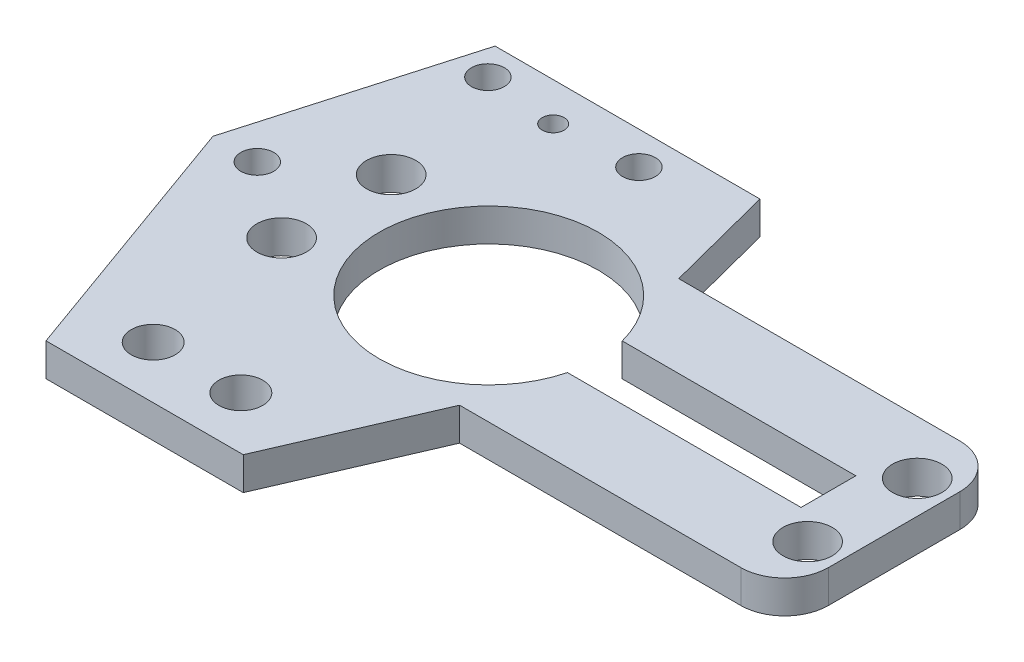
ISO-10303-21;
HEADER;
FILE_DESCRIPTION(('STEP AP214'),'2;1');
FILE_NAME('part.step','',(''),(''),'','','');
FILE_SCHEMA(('AUTOMOTIVE_DESIGN { 1 0 10303 214 1 1 1 1 }'));
ENDSEC;
DATA;
#1=APPLICATION_CONTEXT('core data for automotive mechanical design processes');
#2=APPLICATION_PROTOCOL_DEFINITION('international standard','automotive_design',2000,#1);
#3=PRODUCT_CONTEXT('',#1,'mechanical');
#4=PRODUCT('Part','Part','',(#3));
#5=PRODUCT_RELATED_PRODUCT_CATEGORY('part','',(#4));
#6=PRODUCT_DEFINITION_FORMATION('','',#4);
#7=PRODUCT_DEFINITION_CONTEXT('part definition',#1,'design');
#8=PRODUCT_DEFINITION('design','',#6,#7);
#9=PRODUCT_DEFINITION_SHAPE('','',#8);
#10=(LENGTH_UNIT() NAMED_UNIT(*) SI_UNIT(.MILLI.,.METRE.));
#11=(NAMED_UNIT(*) PLANE_ANGLE_UNIT() SI_UNIT($,.RADIAN.));
#12=(NAMED_UNIT(*) SI_UNIT($,.STERADIAN.) SOLID_ANGLE_UNIT());
#13=UNCERTAINTY_MEASURE_WITH_UNIT(LENGTH_MEASURE(1.E-05),#10,'distance_accuracy_value','');
#14=(GEOMETRIC_REPRESENTATION_CONTEXT(3) GLOBAL_UNCERTAINTY_ASSIGNED_CONTEXT((#13)) GLOBAL_UNIT_ASSIGNED_CONTEXT((#10,
#11,#12)) REPRESENTATION_CONTEXT('',''));
#15=CARTESIAN_POINT('',(0.,0.,0.));
#16=DIRECTION('',(0.,0.,1.));
#17=DIRECTION('',(1.,0.,0.));
#18=AXIS2_PLACEMENT_3D('',#15,#16,#17);
#19=CARTESIAN_POINT('',(0.,3.,0.));
#20=DIRECTION('',(0.,-1.,0.));
#21=DIRECTION('',(0.,0.,-1.));
#22=AXIS2_PLACEMENT_3D('',#19,#20,#21);
#23=PLANE('',#22);
#24=CARTESIAN_POINT('',(-4.,3.,19.));
#25=DIRECTION('',(0.,1.,0.));
#26=DIRECTION('',(0.,0.,1.));
#27=AXIS2_PLACEMENT_3D('',#24,#25,#26);
#28=CIRCLE('',#27,2.);
#29=CARTESIAN_POINT('',(-4.,3.,21.));
#30=VERTEX_POINT('',#29);
#31=EDGE_CURVE('E190',#30,#30,#28,.T.);
#32=ORIENTED_EDGE('',*,*,#31,.F.);
#33=EDGE_LOOP('',(#32));
#34=FACE_BOUND('',#33,.T.);
#35=CARTESIAN_POINT('',(4.32492884768633,3.,-17.));
#36=DIRECTION('',(0.,1.,0.));
#37=DIRECTION('',(0.,0.,1.));
#38=AXIS2_PLACEMENT_3D('',#35,#36,#37);
#39=CIRCLE('',#38,1.5);
#40=CARTESIAN_POINT('',(4.32492884768633,3.,-15.5));
#41=VERTEX_POINT('',#40);
#42=EDGE_CURVE('E196',#41,#41,#39,.T.);
#43=ORIENTED_EDGE('',*,*,#42,.F.);
#44=EDGE_LOOP('',(#43));
#45=FACE_BOUND('',#44,.T.);
#46=DIRECTION('',(1.,0.,0.));
#47=VECTOR('',#46,1.);
#48=CARTESIAN_POINT('',(44.6176903848182,3.,10.));
#49=LINE('',#48,#47);
#50=CARTESIAN_POINT('',(14.9564404640531,3.,10.));
#51=VERTEX_POINT('',#50);
#52=CARTESIAN_POINT('',(40.6176903848182,3.,10.));
#53=VERTEX_POINT('',#52);
#54=EDGE_CURVE('E208',#51,#53,#49,.T.);
#55=ORIENTED_EDGE('',*,*,#54,.T.);
#56=CARTESIAN_POINT('',(40.6176903848182,3.,6.));
#57=DIRECTION('',(0.,-1.,0.));
#58=DIRECTION('',(0.,0.,-1.));
#59=AXIS2_PLACEMENT_3D('',#56,#57,#58);
#60=CIRCLE('',#59,4.);
#61=CARTESIAN_POINT('',(44.6176903848182,3.,6.));
#62=VERTEX_POINT('',#61);
#63=EDGE_CURVE('E43',#53,#62,#60,.F.);
#64=ORIENTED_EDGE('',*,*,#63,.T.);
#65=DIRECTION('',(0.,0.,-1.));
#66=VECTOR('',#65,1.);
#67=CARTESIAN_POINT('',(44.6176903848182,3.,-10.));
#68=LINE('',#67,#66);
#69=CARTESIAN_POINT('',(44.6176903848182,3.,-6.));
#70=VERTEX_POINT('',#69);
#71=EDGE_CURVE('E210',#62,#70,#68,.T.);
#72=ORIENTED_EDGE('',*,*,#71,.T.);
#73=CARTESIAN_POINT('',(40.6176903848182,3.,-6.));
#74=DIRECTION('',(0.,-1.,0.));
#75=DIRECTION('',(0.,0.,-1.));
#76=AXIS2_PLACEMENT_3D('',#73,#74,#75);
#77=CIRCLE('',#76,4.);
#78=CARTESIAN_POINT('',(40.6176903848182,3.,-10.));
#79=VERTEX_POINT('',#78);
#80=EDGE_CURVE('E50',#70,#79,#77,.F.);
#81=ORIENTED_EDGE('',*,*,#80,.T.);
#82=DIRECTION('',(-1.,0.,0.));
#83=VECTOR('',#82,1.);
#84=CARTESIAN_POINT('',(14.9564404640531,3.,-10.));
#85=LINE('',#84,#83);
#86=CARTESIAN_POINT('',(14.9564404640531,3.,-10.));
#87=VERTEX_POINT('',#86);
#88=EDGE_CURVE('E212',#79,#87,#85,.T.);
#89=ORIENTED_EDGE('',*,*,#88,.T.);
#90=DIRECTION('',(-0.250640756696312,0.,-0.968080167694133));
#91=VECTOR('',#90,1.);
#92=CARTESIAN_POINT('',(12.3673908681574,3.,-20.));
#93=LINE('',#92,#91);
#94=CARTESIAN_POINT('',(12.3673908681574,3.,-20.));
#95=VERTEX_POINT('',#94);
#96=EDGE_CURVE('E214',#87,#95,#93,.T.);
#97=ORIENTED_EDGE('',*,*,#96,.T.);
#98=DIRECTION('',(-1.,0.,0.));
#99=VECTOR('',#98,1.);
#100=CARTESIAN_POINT('',(-11.8001879667638,3.,-20.));
#101=LINE('',#100,#99);
#102=CARTESIAN_POINT('',(-11.8001879667638,3.,-20.));
#103=VERTEX_POINT('',#102);
#104=EDGE_CURVE('E216',#95,#103,#101,.T.);
#105=ORIENTED_EDGE('',*,*,#104,.T.);
#106=DIRECTION('',(-0.276187977770996,0.,0.961103636937645));
#107=VECTOR('',#106,1.);
#108=CARTESIAN_POINT('',(-17.5474969385831,3.,0.));
#109=LINE('',#108,#107);
#110=CARTESIAN_POINT('',(-17.5474969385831,3.,0.));
#111=VERTEX_POINT('',#110);
#112=EDGE_CURVE('E218',#103,#111,#109,.T.);
#113=ORIENTED_EDGE('',*,*,#112,.T.);
#114=DIRECTION('',(0.33824944508403,0.,0.941056487624598));
#115=VECTOR('',#114,1.);
#116=CARTESIAN_POINT('',(-9.,3.,23.7803123224836));
#117=LINE('',#116,#115);
#118=CARTESIAN_POINT('',(-9.,3.,23.7803123224836));
#119=VERTEX_POINT('',#118);
#120=EDGE_CURVE('E220',#111,#119,#117,.T.);
#121=ORIENTED_EDGE('',*,*,#120,.T.);
#122=DIRECTION('',(1.,0.,0.));
#123=VECTOR('',#122,1.);
#124=CARTESIAN_POINT('',(-9.,3.,23.7803123224836));
#125=LINE('',#124,#123);
#126=CARTESIAN_POINT('',(9.,3.,23.7803123224836));
#127=VERTEX_POINT('',#126);
#128=EDGE_CURVE('E202',#119,#127,#125,.T.);
#129=ORIENTED_EDGE('',*,*,#128,.T.);
#130=DIRECTION('',(0.39676448254901,0.,-0.917920446110455));
#131=VECTOR('',#130,1.);
#132=CARTESIAN_POINT('',(14.9564404640531,3.,10.));
#133=LINE('',#132,#131);
#134=EDGE_CURVE('E205',#127,#51,#133,.T.);
#135=ORIENTED_EDGE('',*,*,#134,.T.);
#136=EDGE_LOOP('',(#55,#64,#72,#81,#89,#97,#105,#113,#121,#129,#135));
#137=FACE_BOUND('',#136,.T.);
#138=DIRECTION('',(0.,0.,-1.));
#139=VECTOR('',#138,1.);
#140=CARTESIAN_POINT('',(38.6176903848183,3.,2.5));
#141=LINE('',#140,#139);
#142=CARTESIAN_POINT('',(38.6176903848183,3.,2.5));
#143=VERTEX_POINT('',#142);
#144=CARTESIAN_POINT('',(38.6176903848183,3.,-2.5));
#145=VERTEX_POINT('',#144);
#146=EDGE_CURVE('E146',#143,#145,#141,.T.);
#147=ORIENTED_EDGE('',*,*,#146,.F.);
#148=DIRECTION('',(1.,0.,0.));
#149=VECTOR('',#148,1.);
#150=CARTESIAN_POINT('',(17.3001487503368,3.,2.5));
#151=LINE('',#150,#149);
#152=CARTESIAN_POINT('',(17.3001487503368,3.,2.5));
#153=VERTEX_POINT('',#152);
#154=EDGE_CURVE('E172',#153,#143,#151,.T.);
#155=ORIENTED_EDGE('',*,*,#154,.F.);
#156=CARTESIAN_POINT('',(7.61769038481825,3.,0.));
#157=DIRECTION('',(0.,1.,0.));
#158=DIRECTION('',(0.,0.,1.));
#159=AXIS2_PLACEMENT_3D('',#156,#157,#158);
#160=CIRCLE('',#159,9.99999999999999);
#161=CARTESIAN_POINT('',(17.3001487503368,3.,-2.5));
#162=VERTEX_POINT('',#161);
#163=EDGE_CURVE('E170',#162,#153,#160,.T.);
#164=ORIENTED_EDGE('',*,*,#163,.F.);
#165=DIRECTION('',(-1.,0.,0.));
#166=VECTOR('',#165,1.);
#167=CARTESIAN_POINT('',(38.6176903848183,3.,-2.5));
#168=LINE('',#167,#166);
#169=EDGE_CURVE('E156',#145,#162,#168,.T.);
#170=ORIENTED_EDGE('',*,*,#169,.F.);
#171=EDGE_LOOP('',(#147,#155,#164,#170));
#172=FACE_BOUND('',#171,.T.);
#173=CARTESIAN_POINT('',(4.,3.,19.));
#174=DIRECTION('',(0.,1.,0.));
#175=DIRECTION('',(0.,0.,1.));
#176=AXIS2_PLACEMENT_3D('',#173,#174,#175);
#177=CIRCLE('',#176,2.);
#178=CARTESIAN_POINT('',(4.,3.,21.));
#179=VERTEX_POINT('',#178);
#180=EDGE_CURVE('E179',#179,#179,#177,.T.);
#181=ORIENTED_EDGE('',*,*,#180,.F.);
#182=EDGE_LOOP('',(#181));
#183=FACE_BOUND('',#182,.T.);
#184=CARTESIAN_POINT('',(-3.,3.,-16.5));
#185=DIRECTION('',(0.,1.,0.));
#186=DIRECTION('',(0.,0.,1.));
#187=AXIS2_PLACEMENT_3D('',#184,#185,#186);
#188=CIRCLE('',#187,1.);
#189=CARTESIAN_POINT('',(-3.,3.,-15.5));
#190=VERTEX_POINT('',#189);
#191=EDGE_CURVE('E603',#190,#190,#188,.T.);
#192=ORIENTED_EDGE('',*,*,#191,.F.);
#193=EDGE_LOOP('',(#192));
#194=FACE_BOUND('',#193,.T.);
#195=CARTESIAN_POINT('',(-13.5,3.,0.));
#196=DIRECTION('',(0.,1.,0.));
#197=DIRECTION('',(0.,0.,1.));
#198=AXIS2_PLACEMENT_3D('',#195,#196,#197);
#199=CIRCLE('',#198,1.5);
#200=CARTESIAN_POINT('',(-13.5,3.,1.5));
#201=VERTEX_POINT('',#200);
#202=EDGE_CURVE('E597',#201,#201,#199,.T.);
#203=ORIENTED_EDGE('',*,*,#202,.F.);
#204=EDGE_LOOP('',(#203));
#205=FACE_BOUND('',#204,.T.);
#206=CARTESIAN_POINT('',(-9.67339824004157,3.,-17.2164226073759));
#207=DIRECTION('',(0.,1.,0.));
#208=DIRECTION('',(0.,0.,1.));
#209=AXIS2_PLACEMENT_3D('',#206,#207,#208);
#210=CIRCLE('',#209,1.5);
#211=CARTESIAN_POINT('',(-9.67339824004157,3.,-15.7164226073759));
#212=VERTEX_POINT('',#211);
#213=EDGE_CURVE('E591',#212,#212,#210,.T.);
#214=ORIENTED_EDGE('',*,*,#213,.F.);
#215=EDGE_LOOP('',(#214));
#216=FACE_BOUND('',#215,.T.);
#217=CARTESIAN_POINT('',(41.6176903848183,3.,-5.09999999999996));
#218=DIRECTION('',(0.,1.,0.));
#219=DIRECTION('',(0.,0.,1.));
#220=AXIS2_PLACEMENT_3D('',#217,#218,#219);
#221=CIRCLE('',#220,2.25);
#222=CARTESIAN_POINT('',(41.6176903848183,3.,-2.84999999999995));
#223=VERTEX_POINT('',#222);
#224=EDGE_CURVE('E585',#223,#223,#221,.T.);
#225=ORIENTED_EDGE('',*,*,#224,.F.);
#226=EDGE_LOOP('',(#225));
#227=FACE_BOUND('',#226,.T.);
#228=CARTESIAN_POINT('',(41.6176903848183,3.,4.90000000000005));
#229=DIRECTION('',(0.,1.,0.));
#230=DIRECTION('',(0.,0.,1.));
#231=AXIS2_PLACEMENT_3D('',#228,#229,#230);
#232=CIRCLE('',#231,2.25);
#233=CARTESIAN_POINT('',(41.6176903848183,3.,7.15000000000005));
#234=VERTEX_POINT('',#233);
#235=EDGE_CURVE('E579',#234,#234,#232,.T.);
#236=ORIENTED_EDGE('',*,*,#235,.F.);
#237=EDGE_LOOP('',(#236));
#238=FACE_BOUND('',#237,.T.);
#239=CARTESIAN_POINT('',(-6.38230961518174,3.,4.90000000000005));
#240=DIRECTION('',(0.,1.,0.));
#241=DIRECTION('',(0.,0.,1.));
#242=AXIS2_PLACEMENT_3D('',#239,#240,#241);
#243=CIRCLE('',#242,2.25);
#244=CARTESIAN_POINT('',(-6.38230961518174,3.,7.15000000000005));
#245=VERTEX_POINT('',#244);
#246=EDGE_CURVE('E573',#245,#245,#243,.T.);
#247=ORIENTED_EDGE('',*,*,#246,.F.);
#248=EDGE_LOOP('',(#247));
#249=FACE_BOUND('',#248,.T.);
#250=CARTESIAN_POINT('',(-6.38230961518174,3.,-5.09999999999996));
#251=DIRECTION('',(0.,1.,0.));
#252=DIRECTION('',(0.,0.,1.));
#253=AXIS2_PLACEMENT_3D('',#250,#251,#252);
#254=CIRCLE('',#253,2.25);
#255=CARTESIAN_POINT('',(-6.38230961518174,3.,-2.84999999999995));
#256=VERTEX_POINT('',#255);
#257=EDGE_CURVE('E564',#256,#256,#254,.T.);
#258=ORIENTED_EDGE('',*,*,#257,.F.);
#259=EDGE_LOOP('',(#258));
#260=FACE_BOUND('',#259,.T.);
#261=ADVANCED_FACE('F35',(#34,#45,#137,#172,#183,#194,#205,#216,#227,#238,#249,#260),#23,.F.);
#262=CARTESIAN_POINT('',(0.,0.,0.));
#263=DIRECTION('',(0.,-1.,0.));
#264=DIRECTION('',(0.,0.,-1.));
#265=AXIS2_PLACEMENT_3D('',#262,#263,#264);
#266=PLANE('',#265);
#267=CARTESIAN_POINT('',(-6.38230961518174,0.,4.90000000000005));
#268=DIRECTION('',(0.,1.,0.));
#269=DIRECTION('',(0.,0.,1.));
#270=AXIS2_PLACEMENT_3D('',#267,#268,#269);
#271=CIRCLE('',#270,2.25);
#272=CARTESIAN_POINT('',(-6.38230961518174,0.,7.15000000000005));
#273=VERTEX_POINT('',#272);
#274=EDGE_CURVE('E570',#273,#273,#271,.T.);
#275=ORIENTED_EDGE('',*,*,#274,.T.);
#276=EDGE_LOOP('',(#275));
#277=FACE_BOUND('',#276,.T.);
#278=CARTESIAN_POINT('',(41.6176903848183,0.,-5.09999999999996));
#279=DIRECTION('',(0.,1.,0.));
#280=DIRECTION('',(0.,0.,1.));
#281=AXIS2_PLACEMENT_3D('',#278,#279,#280);
#282=CIRCLE('',#281,2.25);
#283=CARTESIAN_POINT('',(41.6176903848183,0.,-2.84999999999995));
#284=VERTEX_POINT('',#283);
#285=EDGE_CURVE('E582',#284,#284,#282,.T.);
#286=ORIENTED_EDGE('',*,*,#285,.T.);
#287=EDGE_LOOP('',(#286));
#288=FACE_BOUND('',#287,.T.);
#289=CARTESIAN_POINT('',(-13.5,0.,0.));
#290=DIRECTION('',(0.,1.,0.));
#291=DIRECTION('',(0.,0.,1.));
#292=AXIS2_PLACEMENT_3D('',#289,#290,#291);
#293=CIRCLE('',#292,1.5);
#294=CARTESIAN_POINT('',(-13.5,0.,1.5));
#295=VERTEX_POINT('',#294);
#296=EDGE_CURVE('E594',#295,#295,#293,.T.);
#297=ORIENTED_EDGE('',*,*,#296,.T.);
#298=EDGE_LOOP('',(#297));
#299=FACE_BOUND('',#298,.T.);
#300=CARTESIAN_POINT('',(4.,0.,19.));
#301=DIRECTION('',(0.,1.,0.));
#302=DIRECTION('',(0.,0.,1.));
#303=AXIS2_PLACEMENT_3D('',#300,#301,#302);
#304=CIRCLE('',#303,2.);
#305=CARTESIAN_POINT('',(4.,0.,21.));
#306=VERTEX_POINT('',#305);
#307=EDGE_CURVE('E606',#306,#306,#304,.T.);
#308=ORIENTED_EDGE('',*,*,#307,.T.);
#309=EDGE_LOOP('',(#308));
#310=FACE_BOUND('',#309,.T.);
#311=CARTESIAN_POINT('',(4.32492884768633,0.,-17.));
#312=DIRECTION('',(0.,1.,0.));
#313=DIRECTION('',(0.,0.,1.));
#314=AXIS2_PLACEMENT_3D('',#311,#312,#313);
#315=CIRCLE('',#314,1.5);
#316=CARTESIAN_POINT('',(4.32492884768633,0.,-15.5));
#317=VERTEX_POINT('',#316);
#318=EDGE_CURVE('E193',#317,#317,#315,.T.);
#319=ORIENTED_EDGE('',*,*,#318,.T.);
#320=EDGE_LOOP('',(#319));
#321=FACE_BOUND('',#320,.T.);
#322=DIRECTION('',(0.,0.,-1.));
#323=VECTOR('',#322,1.);
#324=CARTESIAN_POINT('',(44.6176903848182,0.,-10.));
#325=LINE('',#324,#323);
#326=CARTESIAN_POINT('',(44.6176903848182,0.,6.));
#327=VERTEX_POINT('',#326);
#328=CARTESIAN_POINT('',(44.6176903848182,0.,-6.));
#329=VERTEX_POINT('',#328);
#330=EDGE_CURVE('E229',#327,#329,#325,.T.);
#331=ORIENTED_EDGE('',*,*,#330,.F.);
#332=CARTESIAN_POINT('',(40.6176903848182,0.,6.));
#333=DIRECTION('',(0.,-1.,0.));
#334=DIRECTION('',(0.,0.,-1.));
#335=AXIS2_PLACEMENT_3D('',#332,#333,#334);
#336=CIRCLE('',#335,4.);
#337=CARTESIAN_POINT('',(40.6176903848182,0.,10.));
#338=VERTEX_POINT('',#337);
#339=EDGE_CURVE('E268',#327,#338,#336,.T.);
#340=ORIENTED_EDGE('',*,*,#339,.T.);
#341=DIRECTION('',(1.,0.,0.));
#342=VECTOR('',#341,1.);
#343=CARTESIAN_POINT('',(44.6176903848182,0.,10.));
#344=LINE('',#343,#342);
#345=CARTESIAN_POINT('',(14.9564404640531,0.,10.));
#346=VERTEX_POINT('',#345);
#347=EDGE_CURVE('E227',#346,#338,#344,.T.);
#348=ORIENTED_EDGE('',*,*,#347,.F.);
#349=DIRECTION('',(0.39676448254901,0.,-0.917920446110455));
#350=VECTOR('',#349,1.);
#351=CARTESIAN_POINT('',(14.9564404640531,0.,10.));
#352=LINE('',#351,#350);
#353=CARTESIAN_POINT('',(9.,0.,23.7803123224836));
#354=VERTEX_POINT('',#353);
#355=EDGE_CURVE('E225',#354,#346,#352,.T.);
#356=ORIENTED_EDGE('',*,*,#355,.F.);
#357=DIRECTION('',(1.,0.,0.));
#358=VECTOR('',#357,1.);
#359=CARTESIAN_POINT('',(-9.,0.,23.7803123224836));
#360=LINE('',#359,#358);
#361=CARTESIAN_POINT('',(-9.,0.,23.7803123224836));
#362=VERTEX_POINT('',#361);
#363=EDGE_CURVE('E199',#362,#354,#360,.T.);
#364=ORIENTED_EDGE('',*,*,#363,.F.);
#365=DIRECTION('',(0.33824944508403,0.,0.941056487624598));
#366=VECTOR('',#365,1.);
#367=CARTESIAN_POINT('',(-9.,0.,23.7803123224836));
#368=LINE('',#367,#366);
#369=CARTESIAN_POINT('',(-17.5474969385831,0.,0.));
#370=VERTEX_POINT('',#369);
#371=EDGE_CURVE('E206',#370,#362,#368,.T.);
#372=ORIENTED_EDGE('',*,*,#371,.F.);
#373=DIRECTION('',(-0.276187977770996,0.,0.961103636937645));
#374=VECTOR('',#373,1.);
#375=CARTESIAN_POINT('',(-17.5474969385831,0.,0.));
#376=LINE('',#375,#374);
#377=CARTESIAN_POINT('',(-11.8001879667638,0.,-20.));
#378=VERTEX_POINT('',#377);
#379=EDGE_CURVE('E238',#378,#370,#376,.T.);
#380=ORIENTED_EDGE('',*,*,#379,.F.);
#381=DIRECTION('',(-1.,0.,0.));
#382=VECTOR('',#381,1.);
#383=CARTESIAN_POINT('',(-11.8001879667638,0.,-20.));
#384=LINE('',#383,#382);
#385=CARTESIAN_POINT('',(12.3673908681574,0.,-20.));
#386=VERTEX_POINT('',#385);
#387=EDGE_CURVE('E236',#386,#378,#384,.T.);
#388=ORIENTED_EDGE('',*,*,#387,.F.);
#389=DIRECTION('',(-0.250640756696312,0.,-0.968080167694133));
#390=VECTOR('',#389,1.);
#391=CARTESIAN_POINT('',(12.3673908681574,0.,-20.));
#392=LINE('',#391,#390);
#393=CARTESIAN_POINT('',(14.9564404640531,0.,-10.));
#394=VERTEX_POINT('',#393);
#395=EDGE_CURVE('E234',#394,#386,#392,.T.);
#396=ORIENTED_EDGE('',*,*,#395,.F.);
#397=DIRECTION('',(-1.,0.,0.));
#398=VECTOR('',#397,1.);
#399=CARTESIAN_POINT('',(14.9564404640531,0.,-10.));
#400=LINE('',#399,#398);
#401=CARTESIAN_POINT('',(40.6176903848182,0.,-10.));
#402=VERTEX_POINT('',#401);
#403=EDGE_CURVE('E232',#402,#394,#400,.T.);
#404=ORIENTED_EDGE('',*,*,#403,.F.);
#405=CARTESIAN_POINT('',(40.6176903848182,0.,-6.));
#406=DIRECTION('',(0.,-1.,0.));
#407=DIRECTION('',(0.,0.,-1.));
#408=AXIS2_PLACEMENT_3D('',#405,#406,#407);
#409=CIRCLE('',#408,4.);
#410=EDGE_CURVE('E266',#402,#329,#409,.T.);
#411=ORIENTED_EDGE('',*,*,#410,.T.);
#412=EDGE_LOOP('',(#331,#340,#348,#356,#364,#372,#380,#388,#396,#404,#411));
#413=FACE_BOUND('',#412,.T.);
#414=CARTESIAN_POINT('',(-4.,0.,19.));
#415=DIRECTION('',(0.,1.,0.));
#416=DIRECTION('',(0.,0.,1.));
#417=AXIS2_PLACEMENT_3D('',#414,#415,#416);
#418=CIRCLE('',#417,2.);
#419=CARTESIAN_POINT('',(-4.,0.,21.));
#420=VERTEX_POINT('',#419);
#421=EDGE_CURVE('E164',#420,#420,#418,.T.);
#422=ORIENTED_EDGE('',*,*,#421,.T.);
#423=EDGE_LOOP('',(#422));
#424=FACE_BOUND('',#423,.T.);
#425=DIRECTION('',(1.,0.,0.));
#426=VECTOR('',#425,1.);
#427=CARTESIAN_POINT('',(17.3001487503368,0.,2.5));
#428=LINE('',#427,#426);
#429=CARTESIAN_POINT('',(17.3001487503368,0.,2.5));
#430=VERTEX_POINT('',#429);
#431=CARTESIAN_POINT('',(38.6176903848183,0.,2.5));
#432=VERTEX_POINT('',#431);
#433=EDGE_CURVE('E157',#430,#432,#428,.T.);
#434=ORIENTED_EDGE('',*,*,#433,.T.);
#435=DIRECTION('',(0.,0.,-1.));
#436=VECTOR('',#435,1.);
#437=CARTESIAN_POINT('',(38.6176903848183,0.,2.5));
#438=LINE('',#437,#436);
#439=CARTESIAN_POINT('',(38.6176903848183,0.,-2.5));
#440=VERTEX_POINT('',#439);
#441=EDGE_CURVE('E177',#432,#440,#438,.T.);
#442=ORIENTED_EDGE('',*,*,#441,.T.);
#443=DIRECTION('',(-1.,0.,0.));
#444=VECTOR('',#443,1.);
#445=CARTESIAN_POINT('',(38.6176903848183,0.,-2.5));
#446=LINE('',#445,#444);
#447=CARTESIAN_POINT('',(17.3001487503368,0.,-2.5));
#448=VERTEX_POINT('',#447);
#449=EDGE_CURVE('E163',#440,#448,#446,.T.);
#450=ORIENTED_EDGE('',*,*,#449,.T.);
#451=CARTESIAN_POINT('',(7.61769038481825,0.,0.));
#452=DIRECTION('',(0.,1.,0.));
#453=DIRECTION('',(0.,0.,1.));
#454=AXIS2_PLACEMENT_3D('',#451,#452,#453);
#455=CIRCLE('',#454,9.99999999999999);
#456=EDGE_CURVE('E181',#448,#430,#455,.T.);
#457=ORIENTED_EDGE('',*,*,#456,.T.);
#458=EDGE_LOOP('',(#434,#442,#450,#457));
#459=FACE_BOUND('',#458,.T.);
#460=CARTESIAN_POINT('',(-3.,0.,-16.5));
#461=DIRECTION('',(0.,1.,0.));
#462=DIRECTION('',(0.,0.,1.));
#463=AXIS2_PLACEMENT_3D('',#460,#461,#462);
#464=CIRCLE('',#463,1.);
#465=CARTESIAN_POINT('',(-3.,0.,-15.5));
#466=VERTEX_POINT('',#465);
#467=EDGE_CURVE('E600',#466,#466,#464,.T.);
#468=ORIENTED_EDGE('',*,*,#467,.T.);
#469=EDGE_LOOP('',(#468));
#470=FACE_BOUND('',#469,.T.);
#471=CARTESIAN_POINT('',(-9.67339824004157,0.,-17.2164226073759));
#472=DIRECTION('',(0.,1.,0.));
#473=DIRECTION('',(0.,0.,1.));
#474=AXIS2_PLACEMENT_3D('',#471,#472,#473);
#475=CIRCLE('',#474,1.5);
#476=CARTESIAN_POINT('',(-9.67339824004157,0.,-15.7164226073759));
#477=VERTEX_POINT('',#476);
#478=EDGE_CURVE('E588',#477,#477,#475,.T.);
#479=ORIENTED_EDGE('',*,*,#478,.T.);
#480=EDGE_LOOP('',(#479));
#481=FACE_BOUND('',#480,.T.);
#482=CARTESIAN_POINT('',(41.6176903848183,0.,4.90000000000005));
#483=DIRECTION('',(0.,1.,0.));
#484=DIRECTION('',(0.,0.,1.));
#485=AXIS2_PLACEMENT_3D('',#482,#483,#484);
#486=CIRCLE('',#485,2.25);
#487=CARTESIAN_POINT('',(41.6176903848183,0.,7.15000000000005));
#488=VERTEX_POINT('',#487);
#489=EDGE_CURVE('E576',#488,#488,#486,.T.);
#490=ORIENTED_EDGE('',*,*,#489,.T.);
#491=EDGE_LOOP('',(#490));
#492=FACE_BOUND('',#491,.T.);
#493=CARTESIAN_POINT('',(-6.38230961518174,0.,-5.09999999999996));
#494=DIRECTION('',(0.,1.,0.));
#495=DIRECTION('',(0.,0.,1.));
#496=AXIS2_PLACEMENT_3D('',#493,#494,#495);
#497=CIRCLE('',#496,2.25);
#498=CARTESIAN_POINT('',(-6.38230961518174,0.,-2.84999999999995));
#499=VERTEX_POINT('',#498);
#500=EDGE_CURVE('E567',#499,#499,#497,.T.);
#501=ORIENTED_EDGE('',*,*,#500,.T.);
#502=EDGE_LOOP('',(#501));
#503=FACE_BOUND('',#502,.T.);
#504=ADVANCED_FACE('F282',(#277,#288,#299,#310,#321,#413,#424,#459,#470,#481,#492,#503),#266,.T.);
#505=CARTESIAN_POINT('',(-9.,3.,23.7803123224836));
#506=DIRECTION('',(0.,0.,-1.));
#507=DIRECTION('',(-1.,0.,0.));
#508=AXIS2_PLACEMENT_3D('',#505,#506,#507);
#509=PLANE('',#508);
#510=ORIENTED_EDGE('',*,*,#363,.T.);
#511=DIRECTION('',(0.,-1.,0.));
#512=VECTOR('',#511,1.);
#513=CARTESIAN_POINT('',(9.,3.,23.7803123224836));
#514=LINE('',#513,#512);
#515=EDGE_CURVE('E258',#127,#354,#514,.T.);
#516=ORIENTED_EDGE('',*,*,#515,.F.);
#517=ORIENTED_EDGE('',*,*,#128,.F.);
#518=DIRECTION('',(0.,-1.,0.));
#519=VECTOR('',#518,1.);
#520=CARTESIAN_POINT('',(-9.,3.,23.7803123224836));
#521=LINE('',#520,#519);
#522=EDGE_CURVE('E222',#119,#362,#521,.T.);
#523=ORIENTED_EDGE('',*,*,#522,.T.);
#524=EDGE_LOOP('',(#510,#516,#517,#523));
#525=FACE_BOUND('',#524,.T.);
#526=ADVANCED_FACE('F293',(#525),#509,.F.);
#527=CARTESIAN_POINT('',(14.9564404640531,3.,10.));
#528=DIRECTION('',(-0.917920446110455,0.,-0.39676448254901));
#529=DIRECTION('',(-0.39676448254901,0.,0.917920446110455));
#530=AXIS2_PLACEMENT_3D('',#527,#528,#529);
#531=PLANE('',#530);
#532=ORIENTED_EDGE('',*,*,#355,.T.);
#533=DIRECTION('',(0.,-1.,0.));
#534=VECTOR('',#533,1.);
#535=CARTESIAN_POINT('',(14.9564404640531,3.,10.));
#536=LINE('',#535,#534);
#537=EDGE_CURVE('E255',#51,#346,#536,.T.);
#538=ORIENTED_EDGE('',*,*,#537,.F.);
#539=ORIENTED_EDGE('',*,*,#134,.F.);
#540=ORIENTED_EDGE('',*,*,#515,.T.);
#541=EDGE_LOOP('',(#532,#538,#539,#540));
#542=FACE_BOUND('',#541,.T.);
#543=ADVANCED_FACE('F287',(#542),#531,.F.);
#544=CARTESIAN_POINT('',(44.6176903848182,3.,10.));
#545=DIRECTION('',(0.,0.,-1.));
#546=DIRECTION('',(-1.,0.,0.));
#547=AXIS2_PLACEMENT_3D('',#544,#545,#546);
#548=PLANE('',#547);
#549=ORIENTED_EDGE('',*,*,#347,.T.);
#550=DIRECTION('',(0.,-1.,0.));
#551=VECTOR('',#550,1.);
#552=CARTESIAN_POINT('',(40.6176903848182,3.,10.));
#553=LINE('',#552,#551);
#554=EDGE_CURVE('E58',#338,#53,#553,.F.);
#555=ORIENTED_EDGE('',*,*,#554,.T.);
#556=ORIENTED_EDGE('',*,*,#54,.F.);
#557=ORIENTED_EDGE('',*,*,#537,.T.);
#558=EDGE_LOOP('',(#549,#555,#556,#557));
#559=FACE_BOUND('',#558,.T.);
#560=ADVANCED_FACE('F284',(#559),#548,.F.);
#561=CARTESIAN_POINT('',(44.6176903848182,3.,-10.));
#562=DIRECTION('',(-1.,0.,0.));
#563=DIRECTION('',(0.,0.,1.));
#564=AXIS2_PLACEMENT_3D('',#561,#562,#563);
#565=PLANE('',#564);
#566=ORIENTED_EDGE('',*,*,#71,.F.);
#567=DIRECTION('',(0.,-1.,0.));
#568=VECTOR('',#567,1.);
#569=CARTESIAN_POINT('',(44.6176903848182,3.,6.));
#570=LINE('',#569,#568);
#571=EDGE_CURVE('E263',#62,#327,#570,.T.);
#572=ORIENTED_EDGE('',*,*,#571,.T.);
#573=ORIENTED_EDGE('',*,*,#330,.T.);
#574=DIRECTION('',(0.,-1.,0.));
#575=VECTOR('',#574,1.);
#576=CARTESIAN_POINT('',(44.6176903848182,3.,-6.));
#577=LINE('',#576,#575);
#578=EDGE_CURVE('E261',#329,#70,#577,.F.);
#579=ORIENTED_EDGE('',*,*,#578,.T.);
#580=EDGE_LOOP('',(#566,#572,#573,#579));
#581=FACE_BOUND('',#580,.T.);
#582=ADVANCED_FACE('F276',(#581),#565,.F.);
#583=CARTESIAN_POINT('',(14.9564404640531,3.,-10.));
#584=DIRECTION('',(0.,0.,1.));
#585=DIRECTION('',(1.,0.,0.));
#586=AXIS2_PLACEMENT_3D('',#583,#584,#585);
#587=PLANE('',#586);
#588=ORIENTED_EDGE('',*,*,#88,.F.);
#589=DIRECTION('',(0.,-1.,0.));
#590=VECTOR('',#589,1.);
#591=CARTESIAN_POINT('',(40.6176903848182,3.,-10.));
#592=LINE('',#591,#590);
#593=EDGE_CURVE('E11',#79,#402,#592,.T.);
#594=ORIENTED_EDGE('',*,*,#593,.T.);
#595=ORIENTED_EDGE('',*,*,#403,.T.);
#596=DIRECTION('',(0.,-1.,0.));
#597=VECTOR('',#596,1.);
#598=CARTESIAN_POINT('',(14.9564404640531,3.,-10.));
#599=LINE('',#598,#597);
#600=EDGE_CURVE('E252',#87,#394,#599,.T.);
#601=ORIENTED_EDGE('',*,*,#600,.F.);
#602=EDGE_LOOP('',(#588,#594,#595,#601));
#603=FACE_BOUND('',#602,.T.);
#604=ADVANCED_FACE('F316',(#603),#587,.F.);
#605=CARTESIAN_POINT('',(12.3673908681574,3.,-20.));
#606=DIRECTION('',(-0.968080167694133,0.,0.250640756696312));
#607=DIRECTION('',(0.250640756696312,0.,0.968080167694133));
#608=AXIS2_PLACEMENT_3D('',#605,#606,#607);
#609=PLANE('',#608);
#610=ORIENTED_EDGE('',*,*,#395,.T.);
#611=DIRECTION('',(0.,-1.,0.));
#612=VECTOR('',#611,1.);
#613=CARTESIAN_POINT('',(12.3673908681574,3.,-20.));
#614=LINE('',#613,#612);
#615=EDGE_CURVE('E249',#95,#386,#614,.T.);
#616=ORIENTED_EDGE('',*,*,#615,.F.);
#617=ORIENTED_EDGE('',*,*,#96,.F.);
#618=ORIENTED_EDGE('',*,*,#600,.T.);
#619=EDGE_LOOP('',(#610,#616,#617,#618));
#620=FACE_BOUND('',#619,.T.);
#621=ADVANCED_FACE('F313',(#620),#609,.F.);
#622=CARTESIAN_POINT('',(-11.8001879667638,3.,-20.));
#623=DIRECTION('',(0.,0.,1.));
#624=DIRECTION('',(1.,0.,0.));
#625=AXIS2_PLACEMENT_3D('',#622,#623,#624);
#626=PLANE('',#625);
#627=ORIENTED_EDGE('',*,*,#387,.T.);
#628=DIRECTION('',(0.,-1.,0.));
#629=VECTOR('',#628,1.);
#630=CARTESIAN_POINT('',(-11.8001879667638,3.,-20.));
#631=LINE('',#630,#629);
#632=EDGE_CURVE('E246',#103,#378,#631,.T.);
#633=ORIENTED_EDGE('',*,*,#632,.F.);
#634=ORIENTED_EDGE('',*,*,#104,.F.);
#635=ORIENTED_EDGE('',*,*,#615,.T.);
#636=EDGE_LOOP('',(#627,#633,#634,#635));
#637=FACE_BOUND('',#636,.T.);
#638=ADVANCED_FACE('F308',(#637),#626,.F.);
#639=CARTESIAN_POINT('',(-17.5474969385831,3.,0.));
#640=DIRECTION('',(0.961103636937645,0.,0.276187977770996));
#641=DIRECTION('',(0.276187977770996,0.,-0.961103636937645));
#642=AXIS2_PLACEMENT_3D('',#639,#640,#641);
#643=PLANE('',#642);
#644=ORIENTED_EDGE('',*,*,#379,.T.);
#645=DIRECTION('',(0.,-1.,0.));
#646=VECTOR('',#645,1.);
#647=CARTESIAN_POINT('',(-17.5474969385831,3.,0.));
#648=LINE('',#647,#646);
#649=EDGE_CURVE('E243',#111,#370,#648,.T.);
#650=ORIENTED_EDGE('',*,*,#649,.F.);
#651=ORIENTED_EDGE('',*,*,#112,.F.);
#652=ORIENTED_EDGE('',*,*,#632,.T.);
#653=EDGE_LOOP('',(#644,#650,#651,#652));
#654=FACE_BOUND('',#653,.T.);
#655=ADVANCED_FACE('F302',(#654),#643,.F.);
#656=CARTESIAN_POINT('',(-9.,3.,23.7803123224836));
#657=DIRECTION('',(0.941056487624598,0.,-0.33824944508403));
#658=DIRECTION('',(-0.33824944508403,0.,-0.941056487624598));
#659=AXIS2_PLACEMENT_3D('',#656,#657,#658);
#660=PLANE('',#659);
#661=ORIENTED_EDGE('',*,*,#371,.T.);
#662=ORIENTED_EDGE('',*,*,#522,.F.);
#663=ORIENTED_EDGE('',*,*,#120,.F.);
#664=ORIENTED_EDGE('',*,*,#649,.T.);
#665=EDGE_LOOP('',(#661,#662,#663,#664));
#666=FACE_BOUND('',#665,.T.);
#667=ADVANCED_FACE('F298',(#666),#660,.F.);
#668=CARTESIAN_POINT('',(4.32492884768633,3.,-17.));
#669=DIRECTION('',(0.,-1.,0.));
#670=DIRECTION('',(0.,0.,-1.));
#671=AXIS2_PLACEMENT_3D('',#668,#669,#670);
#672=CYLINDRICAL_SURFACE('',#671,1.5);
#673=ORIENTED_EDGE('',*,*,#42,.T.);
#674=EDGE_LOOP('',(#673));
#675=FACE_BOUND('',#674,.T.);
#676=ORIENTED_EDGE('',*,*,#318,.F.);
#677=EDGE_LOOP('',(#676));
#678=FACE_BOUND('',#677,.T.);
#679=ADVANCED_FACE('F335',(#675,#678),#672,.F.);
#680=CARTESIAN_POINT('',(-4.,3.,19.));
#681=DIRECTION('',(0.,-1.,0.));
#682=DIRECTION('',(0.,0.,-1.));
#683=AXIS2_PLACEMENT_3D('',#680,#681,#682);
#684=CYLINDRICAL_SURFACE('',#683,2.);
#685=ORIENTED_EDGE('',*,*,#31,.T.);
#686=EDGE_LOOP('',(#685));
#687=FACE_BOUND('',#686,.T.);
#688=ORIENTED_EDGE('',*,*,#421,.F.);
#689=EDGE_LOOP('',(#688));
#690=FACE_BOUND('',#689,.T.);
#691=ADVANCED_FACE('F398',(#687,#690),#684,.F.);
#692=CARTESIAN_POINT('',(38.6176903848183,3.,2.5));
#693=DIRECTION('',(-1.,0.,0.));
#694=DIRECTION('',(0.,0.,1.));
#695=AXIS2_PLACEMENT_3D('',#692,#693,#694);
#696=PLANE('',#695);
#697=ORIENTED_EDGE('',*,*,#441,.F.);
#698=DIRECTION('',(0.,-1.,0.));
#699=VECTOR('',#698,1.);
#700=CARTESIAN_POINT('',(38.6176903848183,3.,2.5));
#701=LINE('',#700,#699);
#702=EDGE_CURVE('E152',#143,#432,#701,.T.);
#703=ORIENTED_EDGE('',*,*,#702,.F.);
#704=ORIENTED_EDGE('',*,*,#146,.T.);
#705=DIRECTION('',(0.,-1.,0.));
#706=VECTOR('',#705,1.);
#707=CARTESIAN_POINT('',(38.6176903848183,3.,-2.5));
#708=LINE('',#707,#706);
#709=EDGE_CURVE('E149',#145,#440,#708,.T.);
#710=ORIENTED_EDGE('',*,*,#709,.T.);
#711=EDGE_LOOP('',(#697,#703,#704,#710));
#712=FACE_BOUND('',#711,.T.);
#713=ADVANCED_FACE('F148',(#712),#696,.T.);
#714=CARTESIAN_POINT('',(38.6176903848183,3.,-2.5));
#715=DIRECTION('',(0.,0.,1.));
#716=DIRECTION('',(1.,0.,0.));
#717=AXIS2_PLACEMENT_3D('',#714,#715,#716);
#718=PLANE('',#717);
#719=ORIENTED_EDGE('',*,*,#449,.F.);
#720=ORIENTED_EDGE('',*,*,#709,.F.);
#721=ORIENTED_EDGE('',*,*,#169,.T.);
#722=DIRECTION('',(0.,-1.,0.));
#723=VECTOR('',#722,1.);
#724=CARTESIAN_POINT('',(17.3001487503368,3.,-2.5));
#725=LINE('',#724,#723);
#726=EDGE_CURVE('E165',#162,#448,#725,.T.);
#727=ORIENTED_EDGE('',*,*,#726,.T.);
#728=EDGE_LOOP('',(#719,#720,#721,#727));
#729=FACE_BOUND('',#728,.T.);
#730=ADVANCED_FACE('F160',(#729),#718,.T.);
#731=CARTESIAN_POINT('',(7.61769038481825,3.,0.));
#732=DIRECTION('',(0.,-1.,0.));
#733=DIRECTION('',(0.,0.,-1.));
#734=AXIS2_PLACEMENT_3D('',#731,#732,#733);
#735=CYLINDRICAL_SURFACE('',#734,9.99999999999999);
#736=ORIENTED_EDGE('',*,*,#456,.F.);
#737=ORIENTED_EDGE('',*,*,#726,.F.);
#738=ORIENTED_EDGE('',*,*,#163,.T.);
#739=DIRECTION('',(0.,-1.,0.));
#740=VECTOR('',#739,1.);
#741=CARTESIAN_POINT('',(17.3001487503368,3.,2.5));
#742=LINE('',#741,#740);
#743=EDGE_CURVE('E187',#153,#430,#742,.T.);
#744=ORIENTED_EDGE('',*,*,#743,.T.);
#745=EDGE_LOOP('',(#736,#737,#738,#744));
#746=FACE_BOUND('',#745,.T.);
#747=ADVANCED_FACE('F417',(#746),#735,.F.);
#748=CARTESIAN_POINT('',(17.3001487503368,3.,2.5));
#749=DIRECTION('',(0.,0.,-1.));
#750=DIRECTION('',(-1.,0.,0.));
#751=AXIS2_PLACEMENT_3D('',#748,#749,#750);
#752=PLANE('',#751);
#753=ORIENTED_EDGE('',*,*,#433,.F.);
#754=ORIENTED_EDGE('',*,*,#743,.F.);
#755=ORIENTED_EDGE('',*,*,#154,.T.);
#756=ORIENTED_EDGE('',*,*,#702,.T.);
#757=EDGE_LOOP('',(#753,#754,#755,#756));
#758=FACE_BOUND('',#757,.T.);
#759=ADVANCED_FACE('F424',(#758),#752,.T.);
#760=CARTESIAN_POINT('',(4.,3.,19.));
#761=DIRECTION('',(0.,-1.,0.));
#762=DIRECTION('',(0.,0.,-1.));
#763=AXIS2_PLACEMENT_3D('',#760,#761,#762);
#764=CYLINDRICAL_SURFACE('',#763,2.);
#765=ORIENTED_EDGE('',*,*,#180,.T.);
#766=EDGE_LOOP('',(#765));
#767=FACE_BOUND('',#766,.T.);
#768=ORIENTED_EDGE('',*,*,#307,.F.);
#769=EDGE_LOOP('',(#768));
#770=FACE_BOUND('',#769,.T.);
#771=ADVANCED_FACE('F432',(#767,#770),#764,.F.);
#772=CARTESIAN_POINT('',(-3.,3.,-16.5));
#773=DIRECTION('',(0.,-1.,0.));
#774=DIRECTION('',(0.,0.,-1.));
#775=AXIS2_PLACEMENT_3D('',#772,#773,#774);
#776=CYLINDRICAL_SURFACE('',#775,1.);
#777=ORIENTED_EDGE('',*,*,#191,.T.);
#778=EDGE_LOOP('',(#777));
#779=FACE_BOUND('',#778,.T.);
#780=ORIENTED_EDGE('',*,*,#467,.F.);
#781=EDGE_LOOP('',(#780));
#782=FACE_BOUND('',#781,.T.);
#783=ADVANCED_FACE('F440',(#779,#782),#776,.F.);
#784=CARTESIAN_POINT('',(-13.5,3.,0.));
#785=DIRECTION('',(0.,-1.,0.));
#786=DIRECTION('',(0.,0.,-1.));
#787=AXIS2_PLACEMENT_3D('',#784,#785,#786);
#788=CYLINDRICAL_SURFACE('',#787,1.5);
#789=ORIENTED_EDGE('',*,*,#202,.T.);
#790=EDGE_LOOP('',(#789));
#791=FACE_BOUND('',#790,.T.);
#792=ORIENTED_EDGE('',*,*,#296,.F.);
#793=EDGE_LOOP('',(#792));
#794=FACE_BOUND('',#793,.T.);
#795=ADVANCED_FACE('F448',(#791,#794),#788,.F.);
#796=CARTESIAN_POINT('',(-9.67339824004157,3.,-17.2164226073759));
#797=DIRECTION('',(0.,-1.,0.));
#798=DIRECTION('',(0.,0.,-1.));
#799=AXIS2_PLACEMENT_3D('',#796,#797,#798);
#800=CYLINDRICAL_SURFACE('',#799,1.5);
#801=ORIENTED_EDGE('',*,*,#213,.T.);
#802=EDGE_LOOP('',(#801));
#803=FACE_BOUND('',#802,.T.);
#804=ORIENTED_EDGE('',*,*,#478,.F.);
#805=EDGE_LOOP('',(#804));
#806=FACE_BOUND('',#805,.T.);
#807=ADVANCED_FACE('F456',(#803,#806),#800,.F.);
#808=CARTESIAN_POINT('',(41.6176903848183,3.,-5.09999999999996));
#809=DIRECTION('',(0.,-1.,0.));
#810=DIRECTION('',(0.,0.,-1.));
#811=AXIS2_PLACEMENT_3D('',#808,#809,#810);
#812=CYLINDRICAL_SURFACE('',#811,2.25);
#813=ORIENTED_EDGE('',*,*,#224,.T.);
#814=EDGE_LOOP('',(#813));
#815=FACE_BOUND('',#814,.T.);
#816=ORIENTED_EDGE('',*,*,#285,.F.);
#817=EDGE_LOOP('',(#816));
#818=FACE_BOUND('',#817,.T.);
#819=ADVANCED_FACE('F464',(#815,#818),#812,.F.);
#820=CARTESIAN_POINT('',(41.6176903848183,3.,4.90000000000005));
#821=DIRECTION('',(0.,-1.,0.));
#822=DIRECTION('',(0.,0.,-1.));
#823=AXIS2_PLACEMENT_3D('',#820,#821,#822);
#824=CYLINDRICAL_SURFACE('',#823,2.25);
#825=ORIENTED_EDGE('',*,*,#235,.T.);
#826=EDGE_LOOP('',(#825));
#827=FACE_BOUND('',#826,.T.);
#828=ORIENTED_EDGE('',*,*,#489,.F.);
#829=EDGE_LOOP('',(#828));
#830=FACE_BOUND('',#829,.T.);
#831=ADVANCED_FACE('F472',(#827,#830),#824,.F.);
#832=CARTESIAN_POINT('',(-6.38230961518174,3.,4.90000000000005));
#833=DIRECTION('',(0.,-1.,0.));
#834=DIRECTION('',(0.,0.,-1.));
#835=AXIS2_PLACEMENT_3D('',#832,#833,#834);
#836=CYLINDRICAL_SURFACE('',#835,2.25);
#837=ORIENTED_EDGE('',*,*,#246,.T.);
#838=EDGE_LOOP('',(#837));
#839=FACE_BOUND('',#838,.T.);
#840=ORIENTED_EDGE('',*,*,#274,.F.);
#841=EDGE_LOOP('',(#840));
#842=FACE_BOUND('',#841,.T.);
#843=ADVANCED_FACE('F480',(#839,#842),#836,.F.);
#844=CARTESIAN_POINT('',(-6.38230961518174,3.,-5.09999999999996));
#845=DIRECTION('',(0.,-1.,0.));
#846=DIRECTION('',(0.,0.,-1.));
#847=AXIS2_PLACEMENT_3D('',#844,#845,#846);
#848=CYLINDRICAL_SURFACE('',#847,2.25);
#849=ORIENTED_EDGE('',*,*,#257,.T.);
#850=EDGE_LOOP('',(#849));
#851=FACE_BOUND('',#850,.T.);
#852=ORIENTED_EDGE('',*,*,#500,.F.);
#853=EDGE_LOOP('',(#852));
#854=FACE_BOUND('',#853,.T.);
#855=ADVANCED_FACE('F323',(#851,#854),#848,.F.);
#856=CARTESIAN_POINT('',(40.6176903848182,3.,6.));
#857=DIRECTION('',(0.,-1.,0.));
#858=DIRECTION('',(0.,0.,-1.));
#859=AXIS2_PLACEMENT_3D('',#856,#857,#858);
#860=CYLINDRICAL_SURFACE('',#859,4.);
#861=ORIENTED_EDGE('',*,*,#63,.F.);
#862=ORIENTED_EDGE('',*,*,#554,.F.);
#863=ORIENTED_EDGE('',*,*,#339,.F.);
#864=ORIENTED_EDGE('',*,*,#571,.F.);
#865=EDGE_LOOP('',(#861,#862,#863,#864));
#866=FACE_BOUND('',#865,.T.);
#867=ADVANCED_FACE('F279',(#866),#860,.T.);
#868=CARTESIAN_POINT('',(40.6176903848182,3.,-6.));
#869=DIRECTION('',(0.,-1.,0.));
#870=DIRECTION('',(0.,0.,-1.));
#871=AXIS2_PLACEMENT_3D('',#868,#869,#870);
#872=CYLINDRICAL_SURFACE('',#871,4.);
#873=ORIENTED_EDGE('',*,*,#80,.F.);
#874=ORIENTED_EDGE('',*,*,#578,.F.);
#875=ORIENTED_EDGE('',*,*,#410,.F.);
#876=ORIENTED_EDGE('',*,*,#593,.F.);
#877=EDGE_LOOP('',(#873,#874,#875,#876));
#878=FACE_BOUND('',#877,.T.);
#879=ADVANCED_FACE('F37',(#878),#872,.T.);
#880=CLOSED_SHELL('',(#261,#504,#526,#543,#560,#582,#604,#621,#638,#655,#667,#679,#691,#713,
#730,#747,#759,#771,#783,#795,#807,#819,#831,#843,#855,#867,#879));
#881=MANIFOLD_SOLID_BREP('B2',#880);
#882=ADVANCED_BREP_SHAPE_REPRESENTATION('',(#18,#881),#14);
#883=SHAPE_DEFINITION_REPRESENTATION(#9,#882);
ENDSEC;
END-ISO-10303-21;
